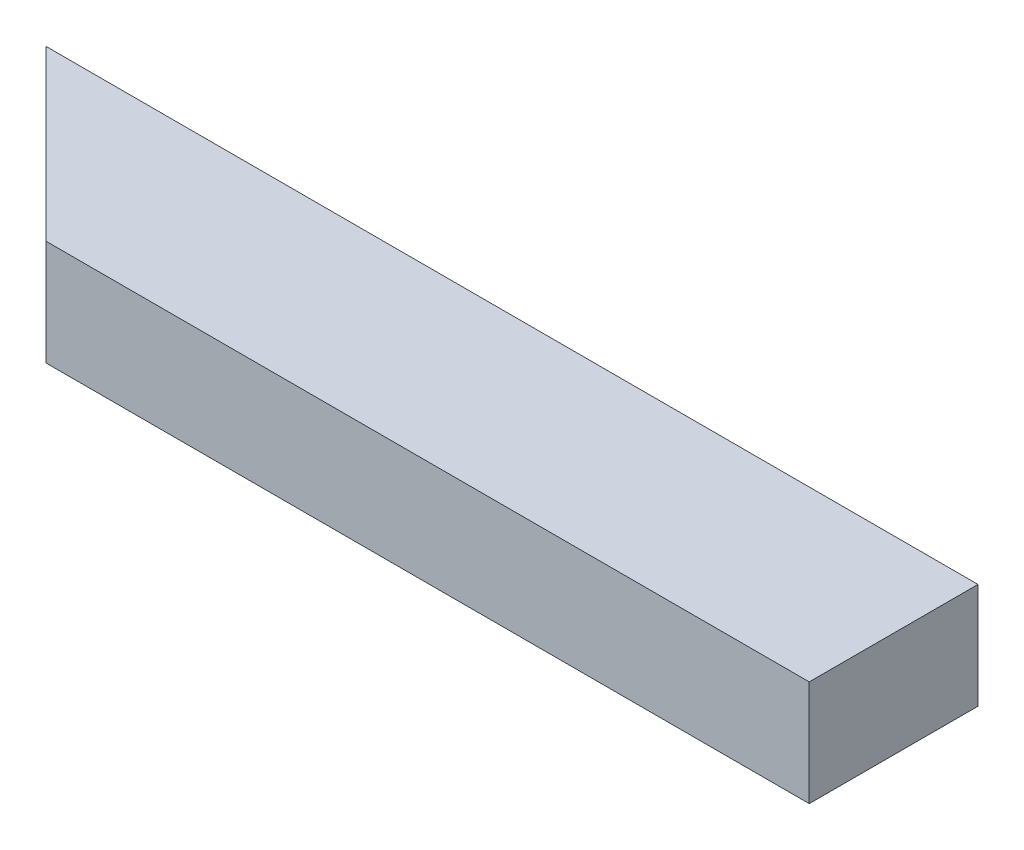
ISO-10303-21;
HEADER;
FILE_DESCRIPTION(('STEP AP214'),'2;1');
FILE_NAME('part.step','',(''),(''),'','','');
FILE_SCHEMA(('AUTOMOTIVE_DESIGN { 1 0 10303 214 1 1 1 1 }'));
ENDSEC;
DATA;
#1=APPLICATION_CONTEXT('core data for automotive mechanical design processes');
#2=APPLICATION_PROTOCOL_DEFINITION('international standard','automotive_design',2000,#1);
#3=PRODUCT_CONTEXT('',#1,'mechanical');
#4=PRODUCT('Part','Part','',(#3));
#5=PRODUCT_RELATED_PRODUCT_CATEGORY('part','',(#4));
#6=PRODUCT_DEFINITION_FORMATION('','',#4);
#7=PRODUCT_DEFINITION_CONTEXT('part definition',#1,'design');
#8=PRODUCT_DEFINITION('design','',#6,#7);
#9=PRODUCT_DEFINITION_SHAPE('','',#8);
#10=(LENGTH_UNIT() NAMED_UNIT(*) SI_UNIT(.MILLI.,.METRE.));
#11=(NAMED_UNIT(*) PLANE_ANGLE_UNIT() SI_UNIT($,.RADIAN.));
#12=(NAMED_UNIT(*) SI_UNIT($,.STERADIAN.) SOLID_ANGLE_UNIT());
#13=UNCERTAINTY_MEASURE_WITH_UNIT(LENGTH_MEASURE(1.E-05),#10,'distance_accuracy_value','');
#14=(GEOMETRIC_REPRESENTATION_CONTEXT(3) GLOBAL_UNCERTAINTY_ASSIGNED_CONTEXT((#13)) GLOBAL_UNIT_ASSIGNED_CONTEXT((#10,
#11,#12)) REPRESENTATION_CONTEXT('',''));
#15=CARTESIAN_POINT('',(0.,0.,0.));
#16=DIRECTION('',(0.,0.,1.));
#17=DIRECTION('',(1.,0.,0.));
#18=AXIS2_PLACEMENT_3D('',#15,#16,#17);
#19=CARTESIAN_POINT('',(-216.671158940017,-11.1124999999998,5.08));
#20=DIRECTION('',(-1.,0.,0.));
#21=DIRECTION('',(0.,0.,1.));
#22=AXIS2_PLACEMENT_3D('',#19,#20,#21);
#23=PLANE('',#22);
#24=DIRECTION('',(0.,1.,0.));
#25=VECTOR('',#24,1.);
#26=CARTESIAN_POINT('',(-216.671158940017,-11.1124999999998,0.));
#27=LINE('',#26,#25);
#28=CARTESIAN_POINT('',(-216.671158940017,-11.1124999999998,0.));
#29=VERTEX_POINT('',#28);
#30=CARTESIAN_POINT('',(-216.671158940017,-7.93749999999984,0.));
#31=VERTEX_POINT('',#30);
#32=EDGE_CURVE('E98',#29,#31,#27,.T.);
#33=ORIENTED_EDGE('',*,*,#32,.T.);
#34=DIRECTION('',(0.,0.,-1.));
#35=VECTOR('',#34,1.);
#36=CARTESIAN_POINT('',(-216.671158940017,-7.93749999999984,5.08));
#37=LINE('',#36,#35);
#38=CARTESIAN_POINT('',(-216.671158940017,-7.93749999999984,5.08));
#39=VERTEX_POINT('',#38);
#40=EDGE_CURVE('E83',#39,#31,#37,.T.);
#41=ORIENTED_EDGE('',*,*,#40,.F.);
#42=DIRECTION('',(0.,1.,0.));
#43=VECTOR('',#42,1.);
#44=CARTESIAN_POINT('',(-216.671158940017,-11.1124999999998,5.08));
#45=LINE('',#44,#43);
#46=CARTESIAN_POINT('',(-216.671158940017,-11.1124999999998,5.08));
#47=VERTEX_POINT('',#46);
#48=EDGE_CURVE('E87',#47,#39,#45,.T.);
#49=ORIENTED_EDGE('',*,*,#48,.F.);
#50=DIRECTION('',(0.,0.,-1.));
#51=VECTOR('',#50,1.);
#52=CARTESIAN_POINT('',(-216.671158940017,-11.1124999999998,5.08));
#53=LINE('',#52,#51);
#54=EDGE_CURVE('E100',#47,#29,#53,.T.);
#55=ORIENTED_EDGE('',*,*,#54,.T.);
#56=EDGE_LOOP('',(#33,#41,#49,#55));
#57=FACE_BOUND('',#56,.T.);
#58=ADVANCED_FACE('F41',(#57),#23,.F.);
#59=CARTESIAN_POINT('',(-216.671158940017,-7.93749999999984,5.08));
#60=DIRECTION('',(0.,-1.,0.));
#61=DIRECTION('',(1.,0.,0.));
#62=AXIS2_PLACEMENT_3D('',#59,#60,#61);
#63=PLANE('',#62);
#64=DIRECTION('',(-1.,0.,0.));
#65=VECTOR('',#64,1.);
#66=CARTESIAN_POINT('',(-216.671158940017,-7.93749999999984,0.));
#67=LINE('',#66,#65);
#68=CARTESIAN_POINT('',(-244.726375923674,-7.93749999999984,0.));
#69=VERTEX_POINT('',#68);
#70=EDGE_CURVE('E112',#31,#69,#67,.T.);
#71=ORIENTED_EDGE('',*,*,#70,.T.);
#72=DIRECTION('',(0.707106781186545,0.,0.70710678118655));
#73=VECTOR('',#72,1.);
#74=CARTESIAN_POINT('',(-239.646375923674,-7.93749999999984,5.08));
#75=LINE('',#74,#73);
#76=CARTESIAN_POINT('',(-239.646375923674,-7.93749999999984,5.08));
#77=VERTEX_POINT('',#76);
#78=EDGE_CURVE('E11',#69,#77,#75,.T.);
#79=ORIENTED_EDGE('',*,*,#78,.T.);
#80=DIRECTION('',(-1.,0.,0.));
#81=VECTOR('',#80,1.);
#82=CARTESIAN_POINT('',(-216.671158940017,-7.93749999999984,5.08));
#83=LINE('',#82,#81);
#84=EDGE_CURVE('E79',#39,#77,#83,.T.);
#85=ORIENTED_EDGE('',*,*,#84,.F.);
#86=ORIENTED_EDGE('',*,*,#40,.T.);
#87=EDGE_LOOP('',(#71,#79,#85,#86));
#88=FACE_BOUND('',#87,.T.);
#89=ADVANCED_FACE('F81',(#88),#63,.F.);
#90=CARTESIAN_POINT('',(-216.671158940017,-11.1124999999998,5.08));
#91=DIRECTION('',(0.,1.,0.));
#92=DIRECTION('',(0.,0.,1.));
#93=AXIS2_PLACEMENT_3D('',#90,#91,#92);
#94=PLANE('',#93);
#95=DIRECTION('',(1.,0.,0.));
#96=VECTOR('',#95,1.);
#97=CARTESIAN_POINT('',(-216.671158940017,-11.1124999999998,5.08));
#98=LINE('',#97,#96);
#99=CARTESIAN_POINT('',(-239.646375923674,-11.1124999999998,5.08));
#100=VERTEX_POINT('',#99);
#101=EDGE_CURVE('E86',#100,#47,#98,.T.);
#102=ORIENTED_EDGE('',*,*,#101,.F.);
#103=DIRECTION('',(-0.707106781186545,0.,-0.70710678118655));
#104=VECTOR('',#103,1.);
#105=CARTESIAN_POINT('',(-239.646375923674,-11.1124999999998,5.08));
#106=LINE('',#105,#104);
#107=CARTESIAN_POINT('',(-244.726375923674,-11.1124999999998,0.));
#108=VERTEX_POINT('',#107);
#109=EDGE_CURVE('E50',#100,#108,#106,.T.);
#110=ORIENTED_EDGE('',*,*,#109,.T.);
#111=DIRECTION('',(1.,0.,0.));
#112=VECTOR('',#111,1.);
#113=CARTESIAN_POINT('',(-216.671158940017,-11.1124999999998,0.));
#114=LINE('',#113,#112);
#115=EDGE_CURVE('E95',#108,#29,#114,.T.);
#116=ORIENTED_EDGE('',*,*,#115,.T.);
#117=ORIENTED_EDGE('',*,*,#54,.F.);
#118=EDGE_LOOP('',(#102,#110,#116,#117));
#119=FACE_BOUND('',#118,.T.);
#120=ADVANCED_FACE('F107',(#119),#94,.F.);
#121=CARTESIAN_POINT('',(0.,0.,5.08));
#122=DIRECTION('',(0.,0.,1.));
#123=DIRECTION('',(1.,0.,0.));
#124=AXIS2_PLACEMENT_3D('',#121,#122,#123);
#125=PLANE('',#124);
#126=ORIENTED_EDGE('',*,*,#84,.T.);
#127=DIRECTION('',(0.,-1.,0.));
#128=VECTOR('',#127,1.);
#129=CARTESIAN_POINT('',(-239.646375923674,-11.1124999999998,5.08));
#130=LINE('',#129,#128);
#131=EDGE_CURVE('E99',#77,#100,#130,.T.);
#132=ORIENTED_EDGE('',*,*,#131,.T.);
#133=ORIENTED_EDGE('',*,*,#101,.T.);
#134=ORIENTED_EDGE('',*,*,#48,.T.);
#135=EDGE_LOOP('',(#126,#132,#133,#134));
#136=FACE_BOUND('',#135,.T.);
#137=ADVANCED_FACE('F90',(#136),#125,.T.);
#138=CARTESIAN_POINT('',(0.,0.,0.));
#139=DIRECTION('',(0.,0.,1.));
#140=DIRECTION('',(1.,0.,0.));
#141=AXIS2_PLACEMENT_3D('',#138,#139,#140);
#142=PLANE('',#141);
#143=ORIENTED_EDGE('',*,*,#32,.F.);
#144=ORIENTED_EDGE('',*,*,#115,.F.);
#145=DIRECTION('',(0.,-1.,0.));
#146=VECTOR('',#145,1.);
#147=CARTESIAN_POINT('',(-244.726375923674,-11.1124999999998,0.));
#148=LINE('',#147,#146);
#149=EDGE_CURVE('E111',#69,#108,#148,.T.);
#150=ORIENTED_EDGE('',*,*,#149,.F.);
#151=ORIENTED_EDGE('',*,*,#70,.F.);
#152=EDGE_LOOP('',(#143,#144,#150,#151));
#153=FACE_BOUND('',#152,.T.);
#154=ADVANCED_FACE('F110',(#153),#142,.F.);
#155=CARTESIAN_POINT('',(-239.646375923674,0.,5.08));
#156=DIRECTION('',(-0.70710678118655,0.,0.707106781186545));
#157=DIRECTION('',(0.,1.,0.));
#158=AXIS2_PLACEMENT_3D('',#155,#156,#157);
#159=PLANE('',#158);
#160=ORIENTED_EDGE('',*,*,#78,.F.);
#161=ORIENTED_EDGE('',*,*,#149,.T.);
#162=ORIENTED_EDGE('',*,*,#109,.F.);
#163=ORIENTED_EDGE('',*,*,#131,.F.);
#164=EDGE_LOOP('',(#160,#161,#162,#163));
#165=FACE_BOUND('',#164,.T.);
#166=ADVANCED_FACE('F44',(#165),#159,.T.);
#167=CLOSED_SHELL('',(#58,#89,#120,#137,#154,#166));
#168=MANIFOLD_SOLID_BREP('B2',#167);
#169=ADVANCED_BREP_SHAPE_REPRESENTATION('',(#18,#168),#14);
#170=SHAPE_DEFINITION_REPRESENTATION(#9,#169);
ENDSEC;
END-ISO-10303-21;
